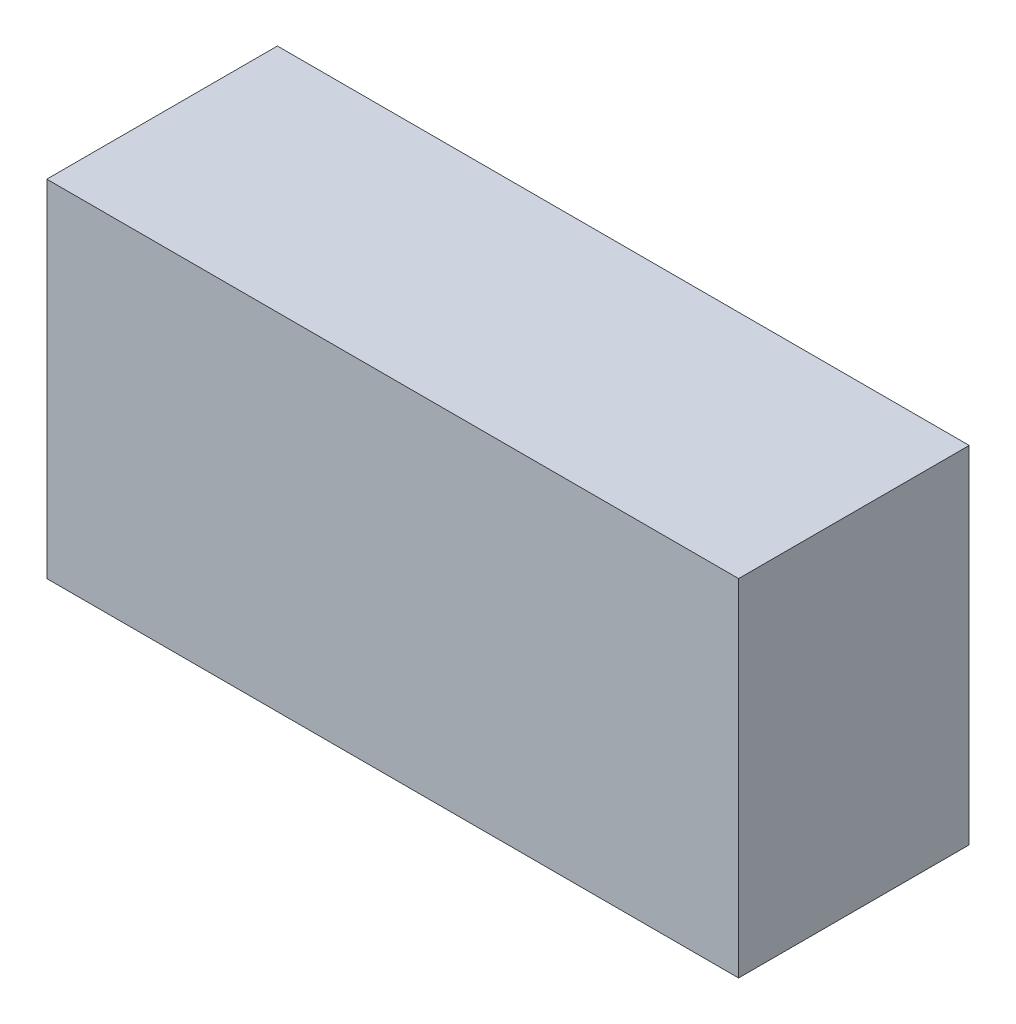
ISO-10303-21;
HEADER;
FILE_DESCRIPTION(('STEP AP214'),'2;1');
FILE_NAME('part.step','',(''),(''),'','','');
FILE_SCHEMA(('AUTOMOTIVE_DESIGN { 1 0 10303 214 1 1 1 1 }'));
ENDSEC;
DATA;
#1=APPLICATION_CONTEXT('core data for automotive mechanical design processes');
#2=APPLICATION_PROTOCOL_DEFINITION('international standard','automotive_design',2000,#1);
#3=PRODUCT_CONTEXT('',#1,'mechanical');
#4=PRODUCT('Part','Part','',(#3));
#5=PRODUCT_RELATED_PRODUCT_CATEGORY('part','',(#4));
#6=PRODUCT_DEFINITION_FORMATION('','',#4);
#7=PRODUCT_DEFINITION_CONTEXT('part definition',#1,'design');
#8=PRODUCT_DEFINITION('design','',#6,#7);
#9=PRODUCT_DEFINITION_SHAPE('','',#8);
#10=(LENGTH_UNIT() NAMED_UNIT(*) SI_UNIT(.MILLI.,.METRE.));
#11=(NAMED_UNIT(*) PLANE_ANGLE_UNIT() SI_UNIT($,.RADIAN.));
#12=(NAMED_UNIT(*) SI_UNIT($,.STERADIAN.) SOLID_ANGLE_UNIT());
#13=UNCERTAINTY_MEASURE_WITH_UNIT(LENGTH_MEASURE(1.E-05),#10,'distance_accuracy_value','');
#14=(GEOMETRIC_REPRESENTATION_CONTEXT(3) GLOBAL_UNCERTAINTY_ASSIGNED_CONTEXT((#13)) GLOBAL_UNIT_ASSIGNED_CONTEXT((#10,
#11,#12)) REPRESENTATION_CONTEXT('',''));
#15=CARTESIAN_POINT('',(0.,0.,0.));
#16=DIRECTION('',(0.,0.,1.));
#17=DIRECTION('',(1.,0.,0.));
#18=AXIS2_PLACEMENT_3D('',#15,#16,#17);
#19=CARTESIAN_POINT('',(0.,0.,20.));
#20=DIRECTION('',(1.,0.,0.));
#21=DIRECTION('',(0.,1.,0.));
#22=AXIS2_PLACEMENT_3D('',#19,#20,#21);
#23=PLANE('',#22);
#24=DIRECTION('',(0.,-1.,0.));
#25=VECTOR('',#24,1.);
#26=CARTESIAN_POINT('',(0.,0.,0.));
#27=LINE('',#26,#25);
#28=CARTESIAN_POINT('',(0.,0.,0.));
#29=VERTEX_POINT('',#28);
#30=CARTESIAN_POINT('',(0.,-30.,0.));
#31=VERTEX_POINT('',#30);
#32=EDGE_CURVE('E107',#29,#31,#27,.T.);
#33=ORIENTED_EDGE('',*,*,#32,.T.);
#34=DIRECTION('',(0.,0.,-1.));
#35=VECTOR('',#34,1.);
#36=CARTESIAN_POINT('',(0.,-30.,20.));
#37=LINE('',#36,#35);
#38=CARTESIAN_POINT('',(0.,-30.,20.));
#39=VERTEX_POINT('',#38);
#40=EDGE_CURVE('E11',#39,#31,#37,.T.);
#41=ORIENTED_EDGE('',*,*,#40,.F.);
#42=DIRECTION('',(0.,-1.,0.));
#43=VECTOR('',#42,1.);
#44=CARTESIAN_POINT('',(0.,0.,20.));
#45=LINE('',#44,#43);
#46=CARTESIAN_POINT('',(0.,0.,20.));
#47=VERTEX_POINT('',#46);
#48=EDGE_CURVE('E89',#47,#39,#45,.T.);
#49=ORIENTED_EDGE('',*,*,#48,.F.);
#50=DIRECTION('',(0.,0.,-1.));
#51=VECTOR('',#50,1.);
#52=CARTESIAN_POINT('',(0.,0.,20.));
#53=LINE('',#52,#51);
#54=EDGE_CURVE('E56',#47,#29,#53,.T.);
#55=ORIENTED_EDGE('',*,*,#54,.T.);
#56=EDGE_LOOP('',(#33,#41,#49,#55));
#57=FACE_BOUND('',#56,.T.);
#58=ADVANCED_FACE('F39',(#57),#23,.F.);
#59=CARTESIAN_POINT('',(0.,-30.,20.));
#60=DIRECTION('',(0.,1.,0.));
#61=DIRECTION('',(0.,0.,1.));
#62=AXIS2_PLACEMENT_3D('',#59,#60,#61);
#63=PLANE('',#62);
#64=DIRECTION('',(1.,0.,0.));
#65=VECTOR('',#64,1.);
#66=CARTESIAN_POINT('',(0.,-30.,0.));
#67=LINE('',#66,#65);
#68=CARTESIAN_POINT('',(60.,-30.,0.));
#69=VERTEX_POINT('',#68);
#70=EDGE_CURVE('E95',#31,#69,#67,.T.);
#71=ORIENTED_EDGE('',*,*,#70,.T.);
#72=DIRECTION('',(0.,0.,-1.));
#73=VECTOR('',#72,1.);
#74=CARTESIAN_POINT('',(60.,-30.,20.));
#75=LINE('',#74,#73);
#76=CARTESIAN_POINT('',(60.,-30.,20.));
#77=VERTEX_POINT('',#76);
#78=EDGE_CURVE('E48',#77,#69,#75,.T.);
#79=ORIENTED_EDGE('',*,*,#78,.F.);
#80=DIRECTION('',(1.,0.,0.));
#81=VECTOR('',#80,1.);
#82=CARTESIAN_POINT('',(0.,-30.,20.));
#83=LINE('',#82,#81);
#84=EDGE_CURVE('E81',#39,#77,#83,.T.);
#85=ORIENTED_EDGE('',*,*,#84,.F.);
#86=ORIENTED_EDGE('',*,*,#40,.T.);
#87=EDGE_LOOP('',(#71,#79,#85,#86));
#88=FACE_BOUND('',#87,.T.);
#89=ADVANCED_FACE('F94',(#88),#63,.F.);
#90=CARTESIAN_POINT('',(60.,0.,20.));
#91=DIRECTION('',(1.,0.,0.));
#92=DIRECTION('',(0.,1.,0.));
#93=AXIS2_PLACEMENT_3D('',#90,#91,#92);
#94=PLANE('',#93);
#95=DIRECTION('',(0.,-1.,0.));
#96=VECTOR('',#95,1.);
#97=CARTESIAN_POINT('',(60.,0.,0.));
#98=LINE('',#97,#96);
#99=CARTESIAN_POINT('',(60.,0.,0.));
#100=VERTEX_POINT('',#99);
#101=EDGE_CURVE('E112',#100,#69,#98,.T.);
#102=ORIENTED_EDGE('',*,*,#101,.F.);
#103=DIRECTION('',(0.,0.,-1.));
#104=VECTOR('',#103,1.);
#105=CARTESIAN_POINT('',(60.,0.,20.));
#106=LINE('',#105,#104);
#107=CARTESIAN_POINT('',(60.,0.,20.));
#108=VERTEX_POINT('',#107);
#109=EDGE_CURVE('E70',#108,#100,#106,.T.);
#110=ORIENTED_EDGE('',*,*,#109,.F.);
#111=DIRECTION('',(0.,-1.,0.));
#112=VECTOR('',#111,1.);
#113=CARTESIAN_POINT('',(60.,0.,20.));
#114=LINE('',#113,#112);
#115=EDGE_CURVE('E88',#108,#77,#114,.T.);
#116=ORIENTED_EDGE('',*,*,#115,.T.);
#117=ORIENTED_EDGE('',*,*,#78,.T.);
#118=EDGE_LOOP('',(#102,#110,#116,#117));
#119=FACE_BOUND('',#118,.T.);
#120=ADVANCED_FACE('F99',(#119),#94,.T.);
#121=CARTESIAN_POINT('',(0.,0.,20.));
#122=DIRECTION('',(0.,1.,0.));
#123=DIRECTION('',(0.,0.,1.));
#124=AXIS2_PLACEMENT_3D('',#121,#122,#123);
#125=PLANE('',#124);
#126=DIRECTION('',(1.,0.,0.));
#127=VECTOR('',#126,1.);
#128=CARTESIAN_POINT('',(0.,0.,0.));
#129=LINE('',#128,#127);
#130=EDGE_CURVE('E115',#29,#100,#129,.T.);
#131=ORIENTED_EDGE('',*,*,#130,.F.);
#132=ORIENTED_EDGE('',*,*,#54,.F.);
#133=DIRECTION('',(1.,0.,0.));
#134=VECTOR('',#133,1.);
#135=CARTESIAN_POINT('',(0.,0.,20.));
#136=LINE('',#135,#134);
#137=EDGE_CURVE('E101',#47,#108,#136,.T.);
#138=ORIENTED_EDGE('',*,*,#137,.T.);
#139=ORIENTED_EDGE('',*,*,#109,.T.);
#140=EDGE_LOOP('',(#131,#132,#138,#139));
#141=FACE_BOUND('',#140,.T.);
#142=ADVANCED_FACE('F125',(#141),#125,.T.);
#143=CARTESIAN_POINT('',(0.,0.,20.));
#144=DIRECTION('',(0.,0.,1.));
#145=DIRECTION('',(1.,0.,0.));
#146=AXIS2_PLACEMENT_3D('',#143,#144,#145);
#147=PLANE('',#146);
#148=ORIENTED_EDGE('',*,*,#48,.T.);
#149=ORIENTED_EDGE('',*,*,#84,.T.);
#150=ORIENTED_EDGE('',*,*,#115,.F.);
#151=ORIENTED_EDGE('',*,*,#137,.F.);
#152=EDGE_LOOP('',(#148,#149,#150,#151));
#153=FACE_BOUND('',#152,.T.);
#154=ADVANCED_FACE('F85',(#153),#147,.T.);
#155=CARTESIAN_POINT('',(0.,0.,0.));
#156=DIRECTION('',(0.,0.,1.));
#157=DIRECTION('',(1.,0.,0.));
#158=AXIS2_PLACEMENT_3D('',#155,#156,#157);
#159=PLANE('',#158);
#160=ORIENTED_EDGE('',*,*,#32,.F.);
#161=ORIENTED_EDGE('',*,*,#130,.T.);
#162=ORIENTED_EDGE('',*,*,#101,.T.);
#163=ORIENTED_EDGE('',*,*,#70,.F.);
#164=EDGE_LOOP('',(#160,#161,#162,#163));
#165=FACE_BOUND('',#164,.T.);
#166=ADVANCED_FACE('F124',(#165),#159,.F.);
#167=CLOSED_SHELL('',(#58,#89,#120,#142,#154,#166));
#168=MANIFOLD_SOLID_BREP('B2',#167);
#169=ADVANCED_BREP_SHAPE_REPRESENTATION('',(#18,#168),#14);
#170=SHAPE_DEFINITION_REPRESENTATION(#9,#169);
ENDSEC;
END-ISO-10303-21;
